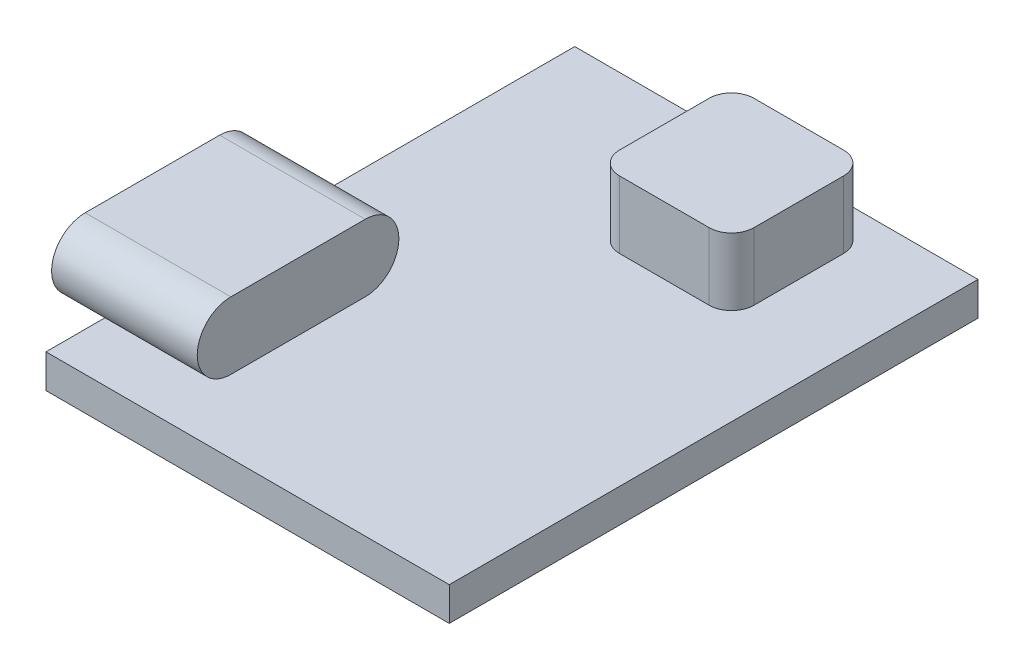
ISO-10303-21;
HEADER;
FILE_DESCRIPTION(('STEP AP214'),'2;1');
FILE_NAME('part.step','',(''),(''),'','','');
FILE_SCHEMA(('AUTOMOTIVE_DESIGN { 1 0 10303 214 1 1 1 1 }'));
ENDSEC;
DATA;
#1=APPLICATION_CONTEXT('core data for automotive mechanical design processes');
#2=APPLICATION_PROTOCOL_DEFINITION('international standard','automotive_design',2000,#1);
#3=PRODUCT_CONTEXT('',#1,'mechanical');
#4=PRODUCT('Part','Part','',(#3));
#5=PRODUCT_RELATED_PRODUCT_CATEGORY('part','',(#4));
#6=PRODUCT_DEFINITION_FORMATION('','',#4);
#7=PRODUCT_DEFINITION_CONTEXT('part definition',#1,'design');
#8=PRODUCT_DEFINITION('design','',#6,#7);
#9=PRODUCT_DEFINITION_SHAPE('','',#8);
#10=(LENGTH_UNIT() NAMED_UNIT(*) SI_UNIT(.MILLI.,.METRE.));
#11=(NAMED_UNIT(*) PLANE_ANGLE_UNIT() SI_UNIT($,.RADIAN.));
#12=(NAMED_UNIT(*) SI_UNIT($,.STERADIAN.) SOLID_ANGLE_UNIT());
#13=UNCERTAINTY_MEASURE_WITH_UNIT(LENGTH_MEASURE(1.E-05),#10,'distance_accuracy_value','');
#14=(GEOMETRIC_REPRESENTATION_CONTEXT(3) GLOBAL_UNCERTAINTY_ASSIGNED_CONTEXT((#13)) GLOBAL_UNIT_ASSIGNED_CONTEXT((#10,
#11,#12)) REPRESENTATION_CONTEXT('',''));
#15=CARTESIAN_POINT('',(0.,0.,0.));
#16=DIRECTION('',(0.,0.,1.));
#17=DIRECTION('',(1.,0.,0.));
#18=AXIS2_PLACEMENT_3D('',#15,#16,#17);
#19=CARTESIAN_POINT('',(-1.,4.5,-10.8));
#20=DIRECTION('',(1.,0.,0.));
#21=DIRECTION('',(0.,0.,-1.));
#22=AXIS2_PLACEMENT_3D('',#19,#20,#21);
#23=PLANE('',#22);
#24=DIRECTION('',(0.,0.,1.));
#25=VECTOR('',#24,1.);
#26=CARTESIAN_POINT('',(-1.,4.5,-10.8));
#27=LINE('',#26,#25);
#28=CARTESIAN_POINT('',(-1.,4.5,-9.8));
#29=VERTEX_POINT('',#28);
#30=CARTESIAN_POINT('',(-1.,4.5,-5.8));
#31=VERTEX_POINT('',#30);
#32=EDGE_CURVE('E143',#29,#31,#27,.T.);
#33=ORIENTED_EDGE('',*,*,#32,.F.);
#34=DIRECTION('',(0.,-1.,0.));
#35=VECTOR('',#34,1.);
#36=CARTESIAN_POINT('',(-1.,4.5,-9.8));
#37=LINE('',#36,#35);
#38=CARTESIAN_POINT('',(-1.,1.5,-9.8));
#39=VERTEX_POINT('',#38);
#40=EDGE_CURVE('E169',#29,#39,#37,.T.);
#41=ORIENTED_EDGE('',*,*,#40,.T.);
#42=DIRECTION('',(0.,0.,1.));
#43=VECTOR('',#42,1.);
#44=CARTESIAN_POINT('',(-1.,1.5,-10.8));
#45=LINE('',#44,#43);
#46=CARTESIAN_POINT('',(-1.,1.5,-5.8));
#47=VERTEX_POINT('',#46);
#48=EDGE_CURVE('E175',#39,#47,#45,.T.);
#49=ORIENTED_EDGE('',*,*,#48,.T.);
#50=DIRECTION('',(0.,-1.,0.));
#51=VECTOR('',#50,1.);
#52=CARTESIAN_POINT('',(-1.,4.5,-5.8));
#53=LINE('',#52,#51);
#54=EDGE_CURVE('E167',#47,#31,#53,.F.);
#55=ORIENTED_EDGE('',*,*,#54,.T.);
#56=EDGE_LOOP('',(#33,#41,#49,#55));
#57=FACE_BOUND('',#56,.T.);
#58=ADVANCED_FACE('F51',(#57),#23,.F.);
#59=CARTESIAN_POINT('',(-1.,4.5,-4.8));
#60=DIRECTION('',(0.,0.,-1.));
#61=DIRECTION('',(-1.,0.,0.));
#62=AXIS2_PLACEMENT_3D('',#59,#60,#61);
#63=PLANE('',#62);
#64=DIRECTION('',(1.,0.,0.));
#65=VECTOR('',#64,1.);
#66=CARTESIAN_POINT('',(-1.,4.5,-4.8));
#67=LINE('',#66,#65);
#68=CARTESIAN_POINT('',(0.,4.5,-4.8));
#69=VERTEX_POINT('',#68);
#70=CARTESIAN_POINT('',(4.,4.5,-4.8));
#71=VERTEX_POINT('',#70);
#72=EDGE_CURVE('E146',#69,#71,#67,.T.);
#73=ORIENTED_EDGE('',*,*,#72,.F.);
#74=DIRECTION('',(0.,-1.,0.));
#75=VECTOR('',#74,1.);
#76=CARTESIAN_POINT('',(0.,4.5,-4.8));
#77=LINE('',#76,#75);
#78=CARTESIAN_POINT('',(0.,1.5,-4.8));
#79=VERTEX_POINT('',#78);
#80=EDGE_CURVE('E12',#69,#79,#77,.T.);
#81=ORIENTED_EDGE('',*,*,#80,.T.);
#82=DIRECTION('',(1.,0.,0.));
#83=VECTOR('',#82,1.);
#84=CARTESIAN_POINT('',(-1.,1.5,-4.8));
#85=LINE('',#84,#83);
#86=CARTESIAN_POINT('',(4.,1.5,-4.8));
#87=VERTEX_POINT('',#86);
#88=EDGE_CURVE('E148',#79,#87,#85,.T.);
#89=ORIENTED_EDGE('',*,*,#88,.T.);
#90=DIRECTION('',(0.,-1.,0.));
#91=VECTOR('',#90,1.);
#92=CARTESIAN_POINT('',(4.,4.5,-4.8));
#93=LINE('',#92,#91);
#94=EDGE_CURVE('E59',#87,#71,#93,.F.);
#95=ORIENTED_EDGE('',*,*,#94,.T.);
#96=EDGE_LOOP('',(#73,#81,#89,#95));
#97=FACE_BOUND('',#96,.T.);
#98=ADVANCED_FACE('F194',(#97),#63,.F.);
#99=CARTESIAN_POINT('',(5.,4.5,-10.8));
#100=DIRECTION('',(-1.,0.,0.));
#101=DIRECTION('',(0.,0.,1.));
#102=AXIS2_PLACEMENT_3D('',#99,#100,#101);
#103=PLANE('',#102);
#104=DIRECTION('',(0.,0.,-1.));
#105=VECTOR('',#104,1.);
#106=CARTESIAN_POINT('',(5.,1.5,-10.8));
#107=LINE('',#106,#105);
#108=CARTESIAN_POINT('',(5.,1.5,-5.8));
#109=VERTEX_POINT('',#108);
#110=CARTESIAN_POINT('',(5.,1.5,-9.8));
#111=VERTEX_POINT('',#110);
#112=EDGE_CURVE('E144',#109,#111,#107,.T.);
#113=ORIENTED_EDGE('',*,*,#112,.T.);
#114=DIRECTION('',(0.,-1.,0.));
#115=VECTOR('',#114,1.);
#116=CARTESIAN_POINT('',(5.,4.5,-9.8));
#117=LINE('',#116,#115);
#118=CARTESIAN_POINT('',(5.,4.5,-9.8));
#119=VERTEX_POINT('',#118);
#120=EDGE_CURVE('E122',#111,#119,#117,.F.);
#121=ORIENTED_EDGE('',*,*,#120,.T.);
#122=DIRECTION('',(0.,0.,-1.));
#123=VECTOR('',#122,1.);
#124=CARTESIAN_POINT('',(5.,4.5,-10.8));
#125=LINE('',#124,#123);
#126=CARTESIAN_POINT('',(5.,4.5,-5.8));
#127=VERTEX_POINT('',#126);
#128=EDGE_CURVE('E183',#127,#119,#125,.T.);
#129=ORIENTED_EDGE('',*,*,#128,.F.);
#130=DIRECTION('',(0.,-1.,0.));
#131=VECTOR('',#130,1.);
#132=CARTESIAN_POINT('',(5.,4.5,-5.8));
#133=LINE('',#132,#131);
#134=EDGE_CURVE('E127',#127,#109,#133,.T.);
#135=ORIENTED_EDGE('',*,*,#134,.T.);
#136=EDGE_LOOP('',(#113,#121,#129,#135));
#137=FACE_BOUND('',#136,.T.);
#138=ADVANCED_FACE('F193',(#137),#103,.F.);
#139=CARTESIAN_POINT('',(-1.,4.5,-10.8));
#140=DIRECTION('',(0.,0.,1.));
#141=DIRECTION('',(1.,0.,0.));
#142=AXIS2_PLACEMENT_3D('',#139,#140,#141);
#143=PLANE('',#142);
#144=DIRECTION('',(-1.,0.,0.));
#145=VECTOR('',#144,1.);
#146=CARTESIAN_POINT('',(-1.,4.5,-10.8));
#147=LINE('',#146,#145);
#148=CARTESIAN_POINT('',(4.,4.5,-10.8));
#149=VERTEX_POINT('',#148);
#150=CARTESIAN_POINT('',(0.,4.5,-10.8));
#151=VERTEX_POINT('',#150);
#152=EDGE_CURVE('E137',#149,#151,#147,.T.);
#153=ORIENTED_EDGE('',*,*,#152,.F.);
#154=DIRECTION('',(0.,-1.,0.));
#155=VECTOR('',#154,1.);
#156=CARTESIAN_POINT('',(4.,4.5,-10.8));
#157=LINE('',#156,#155);
#158=CARTESIAN_POINT('',(4.,1.5,-10.8));
#159=VERTEX_POINT('',#158);
#160=EDGE_CURVE('E121',#149,#159,#157,.T.);
#161=ORIENTED_EDGE('',*,*,#160,.T.);
#162=DIRECTION('',(-1.,0.,0.));
#163=VECTOR('',#162,1.);
#164=CARTESIAN_POINT('',(-1.,1.5,-10.8));
#165=LINE('',#164,#163);
#166=CARTESIAN_POINT('',(0.,1.5,-10.8));
#167=VERTEX_POINT('',#166);
#168=EDGE_CURVE('E134',#159,#167,#165,.T.);
#169=ORIENTED_EDGE('',*,*,#168,.T.);
#170=DIRECTION('',(0.,-1.,0.));
#171=VECTOR('',#170,1.);
#172=CARTESIAN_POINT('',(0.,4.5,-10.8));
#173=LINE('',#172,#171);
#174=EDGE_CURVE('E139',#167,#151,#173,.F.);
#175=ORIENTED_EDGE('',*,*,#174,.T.);
#176=EDGE_LOOP('',(#153,#161,#169,#175));
#177=FACE_BOUND('',#176,.T.);
#178=ADVANCED_FACE('F133',(#177),#143,.F.);
#179=CARTESIAN_POINT('',(0.,4.5,0.));
#180=DIRECTION('',(0.,1.,0.));
#181=DIRECTION('',(0.,0.,1.));
#182=AXIS2_PLACEMENT_3D('',#179,#180,#181);
#183=PLANE('',#182);
#184=ORIENTED_EDGE('',*,*,#128,.T.);
#185=CARTESIAN_POINT('',(4.,4.5,-9.8));
#186=DIRECTION('',(0.,1.,0.));
#187=DIRECTION('',(0.,0.,1.));
#188=AXIS2_PLACEMENT_3D('',#185,#186,#187);
#189=CIRCLE('',#188,1.);
#190=EDGE_CURVE('E165',#119,#149,#189,.T.);
#191=ORIENTED_EDGE('',*,*,#190,.T.);
#192=ORIENTED_EDGE('',*,*,#152,.T.);
#193=CARTESIAN_POINT('',(0.,4.5,-9.8));
#194=DIRECTION('',(0.,1.,0.));
#195=DIRECTION('',(0.,0.,1.));
#196=AXIS2_PLACEMENT_3D('',#193,#194,#195);
#197=CIRCLE('',#196,1.);
#198=EDGE_CURVE('E163',#151,#29,#197,.T.);
#199=ORIENTED_EDGE('',*,*,#198,.T.);
#200=ORIENTED_EDGE('',*,*,#32,.T.);
#201=CARTESIAN_POINT('',(0.,4.5,-5.8));
#202=DIRECTION('',(0.,1.,0.));
#203=DIRECTION('',(0.,0.,1.));
#204=AXIS2_PLACEMENT_3D('',#201,#202,#203);
#205=CIRCLE('',#204,1.);
#206=EDGE_CURVE('E72',#31,#69,#205,.T.);
#207=ORIENTED_EDGE('',*,*,#206,.T.);
#208=ORIENTED_EDGE('',*,*,#72,.T.);
#209=CARTESIAN_POINT('',(4.,4.5,-5.8));
#210=DIRECTION('',(0.,1.,0.));
#211=DIRECTION('',(0.,0.,1.));
#212=AXIS2_PLACEMENT_3D('',#209,#210,#211);
#213=CIRCLE('',#212,1.);
#214=EDGE_CURVE('E160',#71,#127,#213,.T.);
#215=ORIENTED_EDGE('',*,*,#214,.T.);
#216=EDGE_LOOP('',(#184,#191,#192,#199,#200,#207,#208,#215));
#217=FACE_BOUND('',#216,.T.);
#218=ADVANCED_FACE('F187',(#217),#183,.T.);
#219=CARTESIAN_POINT('',(0.,1.5,0.));
#220=DIRECTION('',(0.,1.,0.));
#221=DIRECTION('',(0.,0.,1.));
#222=AXIS2_PLACEMENT_3D('',#219,#220,#221);
#223=PLANE('',#222);
#224=ORIENTED_EDGE('',*,*,#168,.F.);
#225=CARTESIAN_POINT('',(4.,1.5,-9.8));
#226=DIRECTION('',(0.,1.,0.));
#227=DIRECTION('',(0.,0.,1.));
#228=AXIS2_PLACEMENT_3D('',#225,#226,#227);
#229=CIRCLE('',#228,1.);
#230=EDGE_CURVE('E117',#159,#111,#229,.F.);
#231=ORIENTED_EDGE('',*,*,#230,.T.);
#232=ORIENTED_EDGE('',*,*,#112,.F.);
#233=CARTESIAN_POINT('',(4.,1.5,-5.8));
#234=DIRECTION('',(0.,1.,0.));
#235=DIRECTION('',(0.,0.,1.));
#236=AXIS2_PLACEMENT_3D('',#233,#234,#235);
#237=CIRCLE('',#236,1.);
#238=EDGE_CURVE('E138',#109,#87,#237,.F.);
#239=ORIENTED_EDGE('',*,*,#238,.T.);
#240=ORIENTED_EDGE('',*,*,#88,.F.);
#241=CARTESIAN_POINT('',(0.,1.5,-5.8));
#242=DIRECTION('',(0.,1.,0.));
#243=DIRECTION('',(0.,0.,1.));
#244=AXIS2_PLACEMENT_3D('',#241,#242,#243);
#245=CIRCLE('',#244,1.);
#246=EDGE_CURVE('E154',#79,#47,#245,.F.);
#247=ORIENTED_EDGE('',*,*,#246,.T.);
#248=ORIENTED_EDGE('',*,*,#48,.F.);
#249=CARTESIAN_POINT('',(0.,1.5,-9.8));
#250=DIRECTION('',(0.,1.,0.));
#251=DIRECTION('',(0.,0.,1.));
#252=AXIS2_PLACEMENT_3D('',#249,#250,#251);
#253=CIRCLE('',#252,1.);
#254=EDGE_CURVE('E128',#39,#167,#253,.F.);
#255=ORIENTED_EDGE('',*,*,#254,.T.);
#256=EDGE_LOOP('',(#224,#231,#232,#239,#240,#247,#248,#255));
#257=FACE_BOUND('',#256,.T.);
#258=ADVANCED_FACE('F141',(#257),#223,.F.);
#259=CARTESIAN_POINT('',(4.,4.5,-9.8));
#260=DIRECTION('',(0.,-1.,0.));
#261=DIRECTION('',(0.,0.,-1.));
#262=AXIS2_PLACEMENT_3D('',#259,#260,#261);
#263=CYLINDRICAL_SURFACE('',#262,1.);
#264=ORIENTED_EDGE('',*,*,#190,.F.);
#265=ORIENTED_EDGE('',*,*,#120,.F.);
#266=ORIENTED_EDGE('',*,*,#230,.F.);
#267=ORIENTED_EDGE('',*,*,#160,.F.);
#268=EDGE_LOOP('',(#264,#265,#266,#267));
#269=FACE_BOUND('',#268,.T.);
#270=ADVANCED_FACE('F120',(#269),#263,.T.);
#271=CARTESIAN_POINT('',(0.,4.5,-9.8));
#272=DIRECTION('',(0.,-1.,0.));
#273=DIRECTION('',(0.,0.,-1.));
#274=AXIS2_PLACEMENT_3D('',#271,#272,#273);
#275=CYLINDRICAL_SURFACE('',#274,1.);
#276=ORIENTED_EDGE('',*,*,#198,.F.);
#277=ORIENTED_EDGE('',*,*,#174,.F.);
#278=ORIENTED_EDGE('',*,*,#254,.F.);
#279=ORIENTED_EDGE('',*,*,#40,.F.);
#280=EDGE_LOOP('',(#276,#277,#278,#279));
#281=FACE_BOUND('',#280,.T.);
#282=ADVANCED_FACE('F197',(#281),#275,.T.);
#283=CARTESIAN_POINT('',(0.,4.5,-5.8));
#284=DIRECTION('',(0.,-1.,0.));
#285=DIRECTION('',(0.,0.,-1.));
#286=AXIS2_PLACEMENT_3D('',#283,#284,#285);
#287=CYLINDRICAL_SURFACE('',#286,1.);
#288=ORIENTED_EDGE('',*,*,#206,.F.);
#289=ORIENTED_EDGE('',*,*,#54,.F.);
#290=ORIENTED_EDGE('',*,*,#246,.F.);
#291=ORIENTED_EDGE('',*,*,#80,.F.);
#292=EDGE_LOOP('',(#288,#289,#290,#291));
#293=FACE_BOUND('',#292,.T.);
#294=ADVANCED_FACE('F196',(#293),#287,.T.);
#295=CARTESIAN_POINT('',(4.,4.5,-5.8));
#296=DIRECTION('',(0.,-1.,0.));
#297=DIRECTION('',(0.,0.,-1.));
#298=AXIS2_PLACEMENT_3D('',#295,#296,#297);
#299=CYLINDRICAL_SURFACE('',#298,1.);
#300=ORIENTED_EDGE('',*,*,#214,.F.);
#301=ORIENTED_EDGE('',*,*,#94,.F.);
#302=ORIENTED_EDGE('',*,*,#238,.F.);
#303=ORIENTED_EDGE('',*,*,#134,.F.);
#304=EDGE_LOOP('',(#300,#301,#302,#303));
#305=FACE_BOUND('',#304,.T.);
#306=ADVANCED_FACE('F53',(#305),#299,.T.);
#307=CLOSED_SHELL('',(#58,#98,#138,#178,#218,#258,#270,#282,#294,#306));
#308=MANIFOLD_SOLID_BREP('B2',#307);
#309=CARTESIAN_POINT('',(-4.,3.,2.55));
#310=DIRECTION('',(-1.,0.,0.));
#311=DIRECTION('',(0.,0.,1.));
#312=AXIS2_PLACEMENT_3D('',#309,#310,#311);
#313=CYLINDRICAL_SURFACE('',#312,1.5);
#314=DIRECTION('',(-1.,0.,0.));
#315=VECTOR('',#314,1.);
#316=CARTESIAN_POINT('',(-4.,1.5,2.55));
#317=LINE('',#316,#315);
#318=CARTESIAN_POINT('',(-4.,1.5,2.55));
#319=VERTEX_POINT('',#318);
#320=CARTESIAN_POINT('',(-10.5,1.5,2.55));
#321=VERTEX_POINT('',#320);
#322=EDGE_CURVE('E290',#319,#321,#317,.T.);
#323=ORIENTED_EDGE('',*,*,#322,.T.);
#324=CARTESIAN_POINT('',(-10.5,3.,2.55));
#325=DIRECTION('',(-1.,0.,0.));
#326=DIRECTION('',(0.,0.,1.));
#327=AXIS2_PLACEMENT_3D('',#324,#325,#326);
#328=CIRCLE('',#327,1.5);
#329=CARTESIAN_POINT('',(-10.5,4.5,2.55));
#330=VERTEX_POINT('',#329);
#331=EDGE_CURVE('E392',#330,#321,#328,.T.);
#332=ORIENTED_EDGE('',*,*,#331,.F.);
#333=DIRECTION('',(-1.,0.,0.));
#334=VECTOR('',#333,1.);
#335=CARTESIAN_POINT('',(-4.,4.5,2.55));
#336=LINE('',#335,#334);
#337=CARTESIAN_POINT('',(-4.,4.5,2.55));
#338=VERTEX_POINT('',#337);
#339=EDGE_CURVE('E49',#338,#330,#336,.T.);
#340=ORIENTED_EDGE('',*,*,#339,.F.);
#341=CARTESIAN_POINT('',(-4.,3.,2.55));
#342=DIRECTION('',(-1.,0.,0.));
#343=DIRECTION('',(0.,0.,1.));
#344=AXIS2_PLACEMENT_3D('',#341,#342,#343);
#345=CIRCLE('',#344,1.5);
#346=EDGE_CURVE('E404',#338,#319,#345,.T.);
#347=ORIENTED_EDGE('',*,*,#346,.T.);
#348=EDGE_LOOP('',(#323,#332,#340,#347));
#349=FACE_BOUND('',#348,.T.);
#350=ADVANCED_FACE('F287',(#349),#313,.T.);
#351=CARTESIAN_POINT('',(-4.,4.5,2.55));
#352=DIRECTION('',(0.,1.,0.));
#353=DIRECTION('',(0.,0.,1.));
#354=AXIS2_PLACEMENT_3D('',#351,#352,#353);
#355=PLANE('',#354);
#356=ORIENTED_EDGE('',*,*,#339,.T.);
#357=DIRECTION('',(0.,0.,-1.));
#358=VECTOR('',#357,1.);
#359=CARTESIAN_POINT('',(-10.5,4.5,2.55));
#360=LINE('',#359,#358);
#361=CARTESIAN_POINT('',(-10.5,4.5,8.55));
#362=VERTEX_POINT('',#361);
#363=EDGE_CURVE('E401',#362,#330,#360,.T.);
#364=ORIENTED_EDGE('',*,*,#363,.F.);
#365=DIRECTION('',(-1.,0.,0.));
#366=VECTOR('',#365,1.);
#367=CARTESIAN_POINT('',(-4.,4.5,8.55));
#368=LINE('',#367,#366);
#369=CARTESIAN_POINT('',(-4.,4.5,8.55));
#370=VERTEX_POINT('',#369);
#371=EDGE_CURVE('E295',#370,#362,#368,.T.);
#372=ORIENTED_EDGE('',*,*,#371,.F.);
#373=DIRECTION('',(0.,0.,-1.));
#374=VECTOR('',#373,1.);
#375=CARTESIAN_POINT('',(-4.,4.5,2.55));
#376=LINE('',#375,#374);
#377=EDGE_CURVE('E412',#370,#338,#376,.T.);
#378=ORIENTED_EDGE('',*,*,#377,.T.);
#379=EDGE_LOOP('',(#356,#364,#372,#378));
#380=FACE_BOUND('',#379,.T.);
#381=ADVANCED_FACE('F425',(#380),#355,.T.);
#382=CARTESIAN_POINT('',(-4.,3.,8.55));
#383=DIRECTION('',(-1.,0.,0.));
#384=DIRECTION('',(0.,0.,1.));
#385=AXIS2_PLACEMENT_3D('',#382,#383,#384);
#386=CYLINDRICAL_SURFACE('',#385,1.5);
#387=ORIENTED_EDGE('',*,*,#371,.T.);
#388=CARTESIAN_POINT('',(-10.5,3.,8.55));
#389=DIRECTION('',(-1.,0.,0.));
#390=DIRECTION('',(0.,0.,1.));
#391=AXIS2_PLACEMENT_3D('',#388,#389,#390);
#392=CIRCLE('',#391,1.5);
#393=CARTESIAN_POINT('',(-10.5,1.5,8.55));
#394=VERTEX_POINT('',#393);
#395=EDGE_CURVE('E398',#394,#362,#392,.T.);
#396=ORIENTED_EDGE('',*,*,#395,.F.);
#397=DIRECTION('',(-1.,0.,0.));
#398=VECTOR('',#397,1.);
#399=CARTESIAN_POINT('',(-4.,1.5,8.55));
#400=LINE('',#399,#398);
#401=CARTESIAN_POINT('',(-4.,1.5,8.55));
#402=VERTEX_POINT('',#401);
#403=EDGE_CURVE('E415',#402,#394,#400,.T.);
#404=ORIENTED_EDGE('',*,*,#403,.F.);
#405=CARTESIAN_POINT('',(-4.,3.,8.55));
#406=DIRECTION('',(-1.,0.,0.));
#407=DIRECTION('',(0.,0.,1.));
#408=AXIS2_PLACEMENT_3D('',#405,#406,#407);
#409=CIRCLE('',#408,1.5);
#410=EDGE_CURVE('E409',#402,#370,#409,.T.);
#411=ORIENTED_EDGE('',*,*,#410,.T.);
#412=EDGE_LOOP('',(#387,#396,#404,#411));
#413=FACE_BOUND('',#412,.T.);
#414=ADVANCED_FACE('F431',(#413),#386,.T.);
#415=CARTESIAN_POINT('',(-4.,1.5,2.55));
#416=DIRECTION('',(0.,-1.,0.));
#417=DIRECTION('',(0.,0.,-1.));
#418=AXIS2_PLACEMENT_3D('',#415,#416,#417);
#419=PLANE('',#418);
#420=ORIENTED_EDGE('',*,*,#403,.T.);
#421=DIRECTION('',(0.,0.,1.));
#422=VECTOR('',#421,1.);
#423=CARTESIAN_POINT('',(-10.5,1.5,2.55));
#424=LINE('',#423,#422);
#425=EDGE_CURVE('E395',#321,#394,#424,.T.);
#426=ORIENTED_EDGE('',*,*,#425,.F.);
#427=ORIENTED_EDGE('',*,*,#322,.F.);
#428=DIRECTION('',(0.,0.,1.));
#429=VECTOR('',#428,1.);
#430=CARTESIAN_POINT('',(-4.,1.5,2.55));
#431=LINE('',#430,#429);
#432=EDGE_CURVE('E406',#319,#402,#431,.T.);
#433=ORIENTED_EDGE('',*,*,#432,.T.);
#434=EDGE_LOOP('',(#420,#426,#427,#433));
#435=FACE_BOUND('',#434,.T.);
#436=ADVANCED_FACE('F419',(#435),#419,.T.);
#437=CARTESIAN_POINT('',(-4.,3.,2.55));
#438=DIRECTION('',(-1.,0.,0.));
#439=DIRECTION('',(0.,0.,1.));
#440=AXIS2_PLACEMENT_3D('',#437,#438,#439);
#441=PLANE('',#440);
#442=ORIENTED_EDGE('',*,*,#346,.F.);
#443=ORIENTED_EDGE('',*,*,#377,.F.);
#444=ORIENTED_EDGE('',*,*,#410,.F.);
#445=ORIENTED_EDGE('',*,*,#432,.F.);
#446=EDGE_LOOP('',(#442,#443,#444,#445));
#447=FACE_BOUND('',#446,.T.);
#448=ADVANCED_FACE('F429',(#447),#441,.F.);
#449=CARTESIAN_POINT('',(-10.5,3.,2.55));
#450=DIRECTION('',(-1.,0.,0.));
#451=DIRECTION('',(0.,0.,1.));
#452=AXIS2_PLACEMENT_3D('',#449,#450,#451);
#453=PLANE('',#452);
#454=CARTESIAN_POINT('',(-10.5,3.,2.55));
#455=DIRECTION('',(-1.,0.,0.));
#456=DIRECTION('',(0.,0.,1.));
#457=AXIS2_PLACEMENT_3D('',#454,#455,#456);
#458=CIRCLE('',#457,1.2);
#459=CARTESIAN_POINT('',(-10.5,4.2,2.55));
#460=VERTEX_POINT('',#459);
#461=CARTESIAN_POINT('',(-10.5,1.8,2.55));
#462=VERTEX_POINT('',#461);
#463=EDGE_CURVE('E359',#460,#462,#458,.T.);
#464=ORIENTED_EDGE('',*,*,#463,.F.);
#465=DIRECTION('',(0.,0.,-1.));
#466=VECTOR('',#465,1.);
#467=CARTESIAN_POINT('',(-10.5,4.2,2.55));
#468=LINE('',#467,#466);
#469=CARTESIAN_POINT('',(-10.5,4.2,8.55));
#470=VERTEX_POINT('',#469);
#471=EDGE_CURVE('E376',#470,#460,#468,.T.);
#472=ORIENTED_EDGE('',*,*,#471,.F.);
#473=CARTESIAN_POINT('',(-10.5,3.,8.55));
#474=DIRECTION('',(-1.,0.,0.));
#475=DIRECTION('',(0.,0.,1.));
#476=AXIS2_PLACEMENT_3D('',#473,#474,#475);
#477=CIRCLE('',#476,1.2);
#478=CARTESIAN_POINT('',(-10.5,1.8,8.55));
#479=VERTEX_POINT('',#478);
#480=EDGE_CURVE('E303',#479,#470,#477,.T.);
#481=ORIENTED_EDGE('',*,*,#480,.F.);
#482=DIRECTION('',(0.,0.,1.));
#483=VECTOR('',#482,1.);
#484=CARTESIAN_POINT('',(-10.5,1.8,2.55));
#485=LINE('',#484,#483);
#486=EDGE_CURVE('E389',#462,#479,#485,.T.);
#487=ORIENTED_EDGE('',*,*,#486,.F.);
#488=EDGE_LOOP('',(#464,#472,#481,#487));
#489=FACE_BOUND('',#488,.T.);
#490=ORIENTED_EDGE('',*,*,#331,.T.);
#491=ORIENTED_EDGE('',*,*,#425,.T.);
#492=ORIENTED_EDGE('',*,*,#395,.T.);
#493=ORIENTED_EDGE('',*,*,#363,.T.);
#494=EDGE_LOOP('',(#490,#491,#492,#493));
#495=FACE_BOUND('',#494,.T.);
#496=ADVANCED_FACE('F422',(#489,#495),#453,.T.);
#497=CARTESIAN_POINT('',(-4.,3.,2.55));
#498=DIRECTION('',(-1.,0.,0.));
#499=DIRECTION('',(0.,0.,1.));
#500=AXIS2_PLACEMENT_3D('',#497,#498,#499);
#501=CYLINDRICAL_SURFACE('',#500,1.2);
#502=DIRECTION('',(-1.,0.,0.));
#503=VECTOR('',#502,1.);
#504=CARTESIAN_POINT('',(-4.,1.8,2.55));
#505=LINE('',#504,#503);
#506=CARTESIAN_POINT('',(-4.3,1.8,2.55));
#507=VERTEX_POINT('',#506);
#508=EDGE_CURVE('E352',#507,#462,#505,.T.);
#509=ORIENTED_EDGE('',*,*,#508,.F.);
#510=CARTESIAN_POINT('',(-4.3,3.,2.55));
#511=DIRECTION('',(-1.,0.,0.));
#512=DIRECTION('',(0.,0.,1.));
#513=AXIS2_PLACEMENT_3D('',#510,#511,#512);
#514=CIRCLE('',#513,1.2);
#515=CARTESIAN_POINT('',(-4.3,4.2,2.55));
#516=VERTEX_POINT('',#515);
#517=EDGE_CURVE('E356',#516,#507,#514,.T.);
#518=ORIENTED_EDGE('',*,*,#517,.F.);
#519=DIRECTION('',(1.,0.,0.));
#520=VECTOR('',#519,1.);
#521=CARTESIAN_POINT('',(-4.,4.2,2.55));
#522=LINE('',#521,#520);
#523=EDGE_CURVE('E382',#516,#460,#522,.F.);
#524=ORIENTED_EDGE('',*,*,#523,.T.);
#525=ORIENTED_EDGE('',*,*,#463,.T.);
#526=EDGE_LOOP('',(#509,#518,#524,#525));
#527=FACE_BOUND('',#526,.T.);
#528=ADVANCED_FACE('F354',(#527),#501,.F.);
#529=CARTESIAN_POINT('',(-4.,4.2,2.55));
#530=DIRECTION('',(0.,1.,0.));
#531=DIRECTION('',(0.,0.,1.));
#532=AXIS2_PLACEMENT_3D('',#529,#530,#531);
#533=PLANE('',#532);
#534=ORIENTED_EDGE('',*,*,#523,.F.);
#535=DIRECTION('',(0.,0.,-1.));
#536=VECTOR('',#535,1.);
#537=CARTESIAN_POINT('',(-4.3,4.2,2.55));
#538=LINE('',#537,#536);
#539=CARTESIAN_POINT('',(-4.3,4.2,8.55));
#540=VERTEX_POINT('',#539);
#541=EDGE_CURVE('E364',#540,#516,#538,.T.);
#542=ORIENTED_EDGE('',*,*,#541,.F.);
#543=DIRECTION('',(-1.,0.,0.));
#544=VECTOR('',#543,1.);
#545=CARTESIAN_POINT('',(-4.,4.2,8.55));
#546=LINE('',#545,#544);
#547=EDGE_CURVE('E383',#540,#470,#546,.T.);
#548=ORIENTED_EDGE('',*,*,#547,.T.);
#549=ORIENTED_EDGE('',*,*,#471,.T.);
#550=EDGE_LOOP('',(#534,#542,#548,#549));
#551=FACE_BOUND('',#550,.T.);
#552=ADVANCED_FACE('F484',(#551),#533,.F.);
#553=CARTESIAN_POINT('',(-4.,3.,8.55));
#554=DIRECTION('',(-1.,0.,0.));
#555=DIRECTION('',(0.,0.,1.));
#556=AXIS2_PLACEMENT_3D('',#553,#554,#555);
#557=CYLINDRICAL_SURFACE('',#556,1.2);
#558=ORIENTED_EDGE('',*,*,#547,.F.);
#559=CARTESIAN_POINT('',(-4.3,3.,8.55));
#560=DIRECTION('',(-1.,0.,0.));
#561=DIRECTION('',(0.,0.,1.));
#562=AXIS2_PLACEMENT_3D('',#559,#560,#561);
#563=CIRCLE('',#562,1.2);
#564=CARTESIAN_POINT('',(-4.3,1.8,8.55));
#565=VERTEX_POINT('',#564);
#566=EDGE_CURVE('E372',#565,#540,#563,.T.);
#567=ORIENTED_EDGE('',*,*,#566,.F.);
#568=DIRECTION('',(1.,0.,0.));
#569=VECTOR('',#568,1.);
#570=CARTESIAN_POINT('',(-4.,1.8,8.55));
#571=LINE('',#570,#569);
#572=EDGE_CURVE('E363',#565,#479,#571,.F.);
#573=ORIENTED_EDGE('',*,*,#572,.T.);
#574=ORIENTED_EDGE('',*,*,#480,.T.);
#575=EDGE_LOOP('',(#558,#567,#573,#574));
#576=FACE_BOUND('',#575,.T.);
#577=ADVANCED_FACE('F493',(#576),#557,.F.);
#578=CARTESIAN_POINT('',(-4.,1.8,2.55));
#579=DIRECTION('',(0.,-1.,0.));
#580=DIRECTION('',(0.,0.,-1.));
#581=AXIS2_PLACEMENT_3D('',#578,#579,#580);
#582=PLANE('',#581);
#583=ORIENTED_EDGE('',*,*,#572,.F.);
#584=DIRECTION('',(0.,0.,1.));
#585=VECTOR('',#584,1.);
#586=CARTESIAN_POINT('',(-4.3,1.8,2.55));
#587=LINE('',#586,#585);
#588=EDGE_CURVE('E367',#507,#565,#587,.T.);
#589=ORIENTED_EDGE('',*,*,#588,.F.);
#590=ORIENTED_EDGE('',*,*,#508,.T.);
#591=ORIENTED_EDGE('',*,*,#486,.T.);
#592=EDGE_LOOP('',(#583,#589,#590,#591));
#593=FACE_BOUND('',#592,.T.);
#594=ADVANCED_FACE('F368',(#593),#582,.F.);
#595=CARTESIAN_POINT('',(-4.3,3.,2.55));
#596=DIRECTION('',(-1.,0.,0.));
#597=DIRECTION('',(0.,0.,1.));
#598=AXIS2_PLACEMENT_3D('',#595,#596,#597);
#599=PLANE('',#598);
#600=ORIENTED_EDGE('',*,*,#517,.T.);
#601=ORIENTED_EDGE('',*,*,#588,.T.);
#602=ORIENTED_EDGE('',*,*,#566,.T.);
#603=ORIENTED_EDGE('',*,*,#541,.T.);
#604=EDGE_LOOP('',(#600,#601,#602,#603));
#605=FACE_BOUND('',#604,.T.);
#606=ADVANCED_FACE('F374',(#605),#599,.T.);
#607=CLOSED_SHELL('',(#350,#381,#414,#436,#448,#496,#528,#552,#577,#594,#606));
#608=MANIFOLD_SOLID_BREP('B6',#607);
#609=CARTESIAN_POINT('',(9.,1.5,-11.8));
#610=DIRECTION('',(-1.,0.,0.));
#611=DIRECTION('',(0.,0.,1.));
#612=AXIS2_PLACEMENT_3D('',#609,#610,#611);
#613=PLANE('',#612);
#614=DIRECTION('',(0.,0.,-1.));
#615=VECTOR('',#614,1.);
#616=CARTESIAN_POINT('',(9.,0.,-11.8));
#617=LINE('',#616,#615);
#618=CARTESIAN_POINT('',(9.,0.,11.8));
#619=VERTEX_POINT('',#618);
#620=CARTESIAN_POINT('',(9.,0.,-11.8));
#621=VERTEX_POINT('',#620);
#622=EDGE_CURVE('E588',#619,#621,#617,.T.);
#623=ORIENTED_EDGE('',*,*,#622,.T.);
#624=DIRECTION('',(0.,-1.,0.));
#625=VECTOR('',#624,1.);
#626=CARTESIAN_POINT('',(9.,1.5,-11.8));
#627=LINE('',#626,#625);
#628=CARTESIAN_POINT('',(9.,1.5,-11.8));
#629=VERTEX_POINT('',#628);
#630=EDGE_CURVE('E285',#629,#621,#627,.T.);
#631=ORIENTED_EDGE('',*,*,#630,.F.);
#632=DIRECTION('',(0.,0.,-1.));
#633=VECTOR('',#632,1.);
#634=CARTESIAN_POINT('',(9.,1.5,-11.8));
#635=LINE('',#634,#633);
#636=CARTESIAN_POINT('',(9.,1.5,11.8));
#637=VERTEX_POINT('',#636);
#638=EDGE_CURVE('E576',#637,#629,#635,.T.);
#639=ORIENTED_EDGE('',*,*,#638,.F.);
#640=DIRECTION('',(0.,-1.,0.));
#641=VECTOR('',#640,1.);
#642=CARTESIAN_POINT('',(9.,1.5,11.8));
#643=LINE('',#642,#641);
#644=EDGE_CURVE('E584',#637,#619,#643,.T.);
#645=ORIENTED_EDGE('',*,*,#644,.T.);
#646=EDGE_LOOP('',(#623,#631,#639,#645));
#647=FACE_BOUND('',#646,.T.);
#648=ADVANCED_FACE('F525',(#647),#613,.F.);
#649=CARTESIAN_POINT('',(-9.,1.5,-11.8));
#650=DIRECTION('',(0.,0.,1.));
#651=DIRECTION('',(1.,0.,0.));
#652=AXIS2_PLACEMENT_3D('',#649,#650,#651);
#653=PLANE('',#652);
#654=DIRECTION('',(-1.,0.,0.));
#655=VECTOR('',#654,1.);
#656=CARTESIAN_POINT('',(-9.,0.,-11.8));
#657=LINE('',#656,#655);
#658=CARTESIAN_POINT('',(-9.,0.,-11.8));
#659=VERTEX_POINT('',#658);
#660=EDGE_CURVE('E580',#621,#659,#657,.T.);
#661=ORIENTED_EDGE('',*,*,#660,.T.);
#662=DIRECTION('',(0.,-1.,0.));
#663=VECTOR('',#662,1.);
#664=CARTESIAN_POINT('',(-9.,1.5,-11.8));
#665=LINE('',#664,#663);
#666=CARTESIAN_POINT('',(-9.,1.5,-11.8));
#667=VERTEX_POINT('',#666);
#668=EDGE_CURVE('E533',#667,#659,#665,.T.);
#669=ORIENTED_EDGE('',*,*,#668,.F.);
#670=DIRECTION('',(-1.,0.,0.));
#671=VECTOR('',#670,1.);
#672=CARTESIAN_POINT('',(-9.,1.5,-11.8));
#673=LINE('',#672,#671);
#674=EDGE_CURVE('E571',#629,#667,#673,.T.);
#675=ORIENTED_EDGE('',*,*,#674,.F.);
#676=ORIENTED_EDGE('',*,*,#630,.T.);
#677=EDGE_LOOP('',(#661,#669,#675,#676));
#678=FACE_BOUND('',#677,.T.);
#679=ADVANCED_FACE('F579',(#678),#653,.F.);
#680=CARTESIAN_POINT('',(-9.,1.5,-11.8));
#681=DIRECTION('',(1.,0.,0.));
#682=DIRECTION('',(0.,0.,-1.));
#683=AXIS2_PLACEMENT_3D('',#680,#681,#682);
#684=PLANE('',#683);
#685=DIRECTION('',(0.,0.,1.));
#686=VECTOR('',#685,1.);
#687=CARTESIAN_POINT('',(-9.,0.,-11.8));
#688=LINE('',#687,#686);
#689=CARTESIAN_POINT('',(-9.,0.,11.8));
#690=VERTEX_POINT('',#689);
#691=EDGE_CURVE('E558',#659,#690,#688,.T.);
#692=ORIENTED_EDGE('',*,*,#691,.T.);
#693=DIRECTION('',(0.,-1.,0.));
#694=VECTOR('',#693,1.);
#695=CARTESIAN_POINT('',(-9.,1.5,11.8));
#696=LINE('',#695,#694);
#697=CARTESIAN_POINT('',(-9.,1.5,11.8));
#698=VERTEX_POINT('',#697);
#699=EDGE_CURVE('E581',#698,#690,#696,.T.);
#700=ORIENTED_EDGE('',*,*,#699,.F.);
#701=DIRECTION('',(0.,0.,1.));
#702=VECTOR('',#701,1.);
#703=CARTESIAN_POINT('',(-9.,1.5,-11.8));
#704=LINE('',#703,#702);
#705=EDGE_CURVE('E574',#667,#698,#704,.T.);
#706=ORIENTED_EDGE('',*,*,#705,.F.);
#707=ORIENTED_EDGE('',*,*,#668,.T.);
#708=EDGE_LOOP('',(#692,#700,#706,#707));
#709=FACE_BOUND('',#708,.T.);
#710=ADVANCED_FACE('F582',(#709),#684,.F.);
#711=CARTESIAN_POINT('',(-9.,1.5,11.8));
#712=DIRECTION('',(0.,0.,-1.));
#713=DIRECTION('',(-1.,0.,0.));
#714=AXIS2_PLACEMENT_3D('',#711,#712,#713);
#715=PLANE('',#714);
#716=DIRECTION('',(1.,0.,0.));
#717=VECTOR('',#716,1.);
#718=CARTESIAN_POINT('',(-9.,0.,11.8));
#719=LINE('',#718,#717);
#720=EDGE_CURVE('E564',#690,#619,#719,.T.);
#721=ORIENTED_EDGE('',*,*,#720,.T.);
#722=ORIENTED_EDGE('',*,*,#644,.F.);
#723=DIRECTION('',(1.,0.,0.));
#724=VECTOR('',#723,1.);
#725=CARTESIAN_POINT('',(-9.,1.5,11.8));
#726=LINE('',#725,#724);
#727=EDGE_CURVE('E541',#698,#637,#726,.T.);
#728=ORIENTED_EDGE('',*,*,#727,.F.);
#729=ORIENTED_EDGE('',*,*,#699,.T.);
#730=EDGE_LOOP('',(#721,#722,#728,#729));
#731=FACE_BOUND('',#730,.T.);
#732=ADVANCED_FACE('F595',(#731),#715,.F.);
#733=CARTESIAN_POINT('',(0.,1.5,0.));
#734=DIRECTION('',(0.,1.,0.));
#735=DIRECTION('',(0.,0.,1.));
#736=AXIS2_PLACEMENT_3D('',#733,#734,#735);
#737=PLANE('',#736);
#738=ORIENTED_EDGE('',*,*,#638,.T.);
#739=ORIENTED_EDGE('',*,*,#674,.T.);
#740=ORIENTED_EDGE('',*,*,#705,.T.);
#741=ORIENTED_EDGE('',*,*,#727,.T.);
#742=EDGE_LOOP('',(#738,#739,#740,#741));
#743=FACE_BOUND('',#742,.T.);
#744=ADVANCED_FACE('F572',(#743),#737,.T.);
#745=CARTESIAN_POINT('',(0.,0.,0.));
#746=DIRECTION('',(0.,1.,0.));
#747=DIRECTION('',(0.,0.,1.));
#748=AXIS2_PLACEMENT_3D('',#745,#746,#747);
#749=PLANE('',#748);
#750=ORIENTED_EDGE('',*,*,#622,.F.);
#751=ORIENTED_EDGE('',*,*,#720,.F.);
#752=ORIENTED_EDGE('',*,*,#691,.F.);
#753=ORIENTED_EDGE('',*,*,#660,.F.);
#754=EDGE_LOOP('',(#750,#751,#752,#753));
#755=FACE_BOUND('',#754,.T.);
#756=ADVANCED_FACE('F598',(#755),#749,.F.);
#757=CLOSED_SHELL('',(#648,#679,#710,#732,#744,#756));
#758=MANIFOLD_SOLID_BREP('B43',#757);
#759=ADVANCED_BREP_SHAPE_REPRESENTATION('',(#18,#308,#608,#758),#14);
#760=SHAPE_DEFINITION_REPRESENTATION(#9,#759);
ENDSEC;
END-ISO-10303-21;
